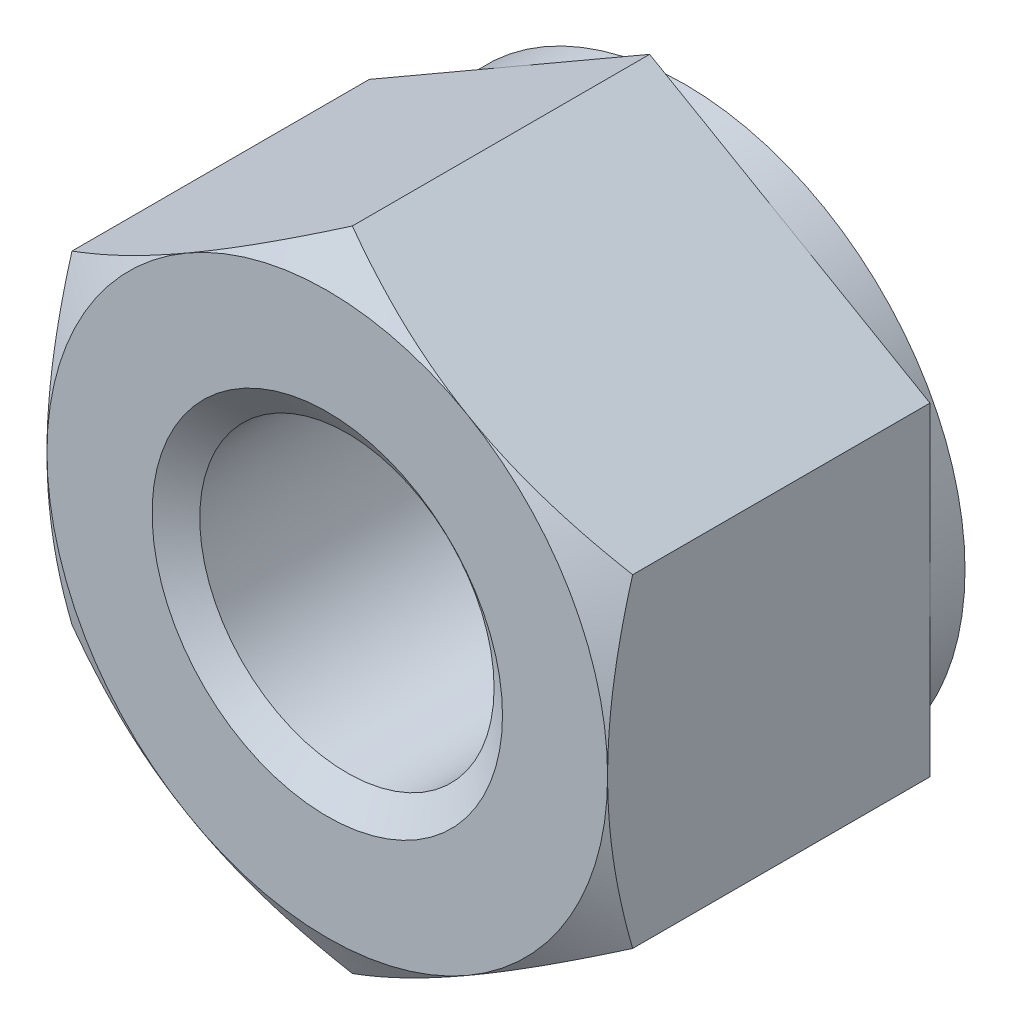
ISO-10303-21;
HEADER;
FILE_DESCRIPTION(('STEP AP214'),'2;1');
FILE_NAME('part.step','',(''),(''),'','','');
FILE_SCHEMA(('AUTOMOTIVE_DESIGN { 1 0 10303 214 1 1 1 1 }'));
ENDSEC;
DATA;
#1=APPLICATION_CONTEXT('core data for automotive mechanical design processes');
#2=APPLICATION_PROTOCOL_DEFINITION('international standard','automotive_design',2000,#1);
#3=PRODUCT_CONTEXT('',#1,'mechanical');
#4=PRODUCT('Part','Part','',(#3));
#5=PRODUCT_RELATED_PRODUCT_CATEGORY('part','',(#4));
#6=PRODUCT_DEFINITION_FORMATION('','',#4);
#7=PRODUCT_DEFINITION_CONTEXT('part definition',#1,'design');
#8=PRODUCT_DEFINITION('design','',#6,#7);
#9=PRODUCT_DEFINITION_SHAPE('','',#8);
#10=(LENGTH_UNIT() NAMED_UNIT(*) SI_UNIT(.MILLI.,.METRE.));
#11=(NAMED_UNIT(*) PLANE_ANGLE_UNIT() SI_UNIT($,.RADIAN.));
#12=(NAMED_UNIT(*) SI_UNIT($,.STERADIAN.) SOLID_ANGLE_UNIT());
#13=UNCERTAINTY_MEASURE_WITH_UNIT(LENGTH_MEASURE(1.E-05),#10,'distance_accuracy_value','');
#14=(GEOMETRIC_REPRESENTATION_CONTEXT(3) GLOBAL_UNCERTAINTY_ASSIGNED_CONTEXT((#13)) GLOBAL_UNIT_ASSIGNED_CONTEXT((#10,
#11,#12)) REPRESENTATION_CONTEXT('',''));
#15=CARTESIAN_POINT('',(0.,0.,0.));
#16=DIRECTION('',(0.,0.,1.));
#17=DIRECTION('',(1.,0.,0.));
#18=AXIS2_PLACEMENT_3D('',#15,#16,#17);
#19=CARTESIAN_POINT('',(0.,0.,-5.1));
#20=DIRECTION('',(0.,0.,1.));
#21=DIRECTION('',(1.,0.,0.));
#22=AXIS2_PLACEMENT_3D('',#19,#20,#21);
#23=CYLINDRICAL_SURFACE('',#22,2.1);
#24=CARTESIAN_POINT('',(0.,0.,-0.28008301528388));
#25=DIRECTION('',(0.,0.,1.));
#26=DIRECTION('',(1.,0.,0.));
#27=AXIS2_PLACEMENT_3D('',#24,#25,#26);
#28=CIRCLE('',#27,2.1);
#29=CARTESIAN_POINT('',(2.1,0.,-0.28008301528388));
#30=VERTEX_POINT('',#29);
#31=EDGE_CURVE('E158',#30,#30,#28,.F.);
#32=ORIENTED_EDGE('',*,*,#31,.F.);
#33=EDGE_LOOP('',(#32));
#34=FACE_BOUND('',#33,.T.);
#35=CARTESIAN_POINT('',(0.,0.,-4.79451698471612));
#36=DIRECTION('',(0.,0.,-1.));
#37=DIRECTION('',(-1.,0.,0.));
#38=AXIS2_PLACEMENT_3D('',#35,#36,#37);
#39=CIRCLE('',#38,2.1);
#40=CARTESIAN_POINT('',(-2.1,0.,-4.79451698471612));
#41=VERTEX_POINT('',#40);
#42=EDGE_CURVE('E48',#41,#41,#39,.F.);
#43=ORIENTED_EDGE('',*,*,#42,.F.);
#44=EDGE_LOOP('',(#43));
#45=FACE_BOUND('',#44,.T.);
#46=ADVANCED_FACE('F43',(#34,#45),#23,.F.);
#47=CARTESIAN_POINT('',(0.,4.61880215351702,-5.1));
#48=DIRECTION('',(-0.500000000000002,0.866025403784437,0.));
#49=DIRECTION('',(-0.866025403784437,-0.500000000000002,0.));
#50=AXIS2_PLACEMENT_3D('',#47,#48,#49);
#51=PLANE('',#50);
#52=DIRECTION('',(0.,0.,1.));
#53=VECTOR('',#52,1.);
#54=CARTESIAN_POINT('',(-4.,2.3094010767585,-5.1));
#55=LINE('',#54,#53);
#56=CARTESIAN_POINT('',(-4.,2.3094010767585,-4.6));
#57=VERTEX_POINT('',#56);
#58=CARTESIAN_POINT('',(-4.,2.3094010767585,-0.357265589908173));
#59=VERTEX_POINT('',#58);
#60=EDGE_CURVE('E305',#57,#59,#55,.T.);
#61=ORIENTED_EDGE('',*,*,#60,.T.);
#62=CARTESIAN_POINT('',(-4.0002,2.30928560670466,-0.357332259074767));
#63=CARTESIAN_POINT('',(-3.82442084967677,2.4107717464617,-0.298717873648282));
#64=CARTESIAN_POINT('',(-3.64712438367362,2.51313390883499,-0.245410321462262));
#65=CARTESIAN_POINT('',(-3.28946140682429,2.71963072479811,-0.152361670746403));
#66=CARTESIAN_POINT('',(-3.10908854102985,2.82376904741904,-0.112653489029703));
#67=CARTESIAN_POINT('',(-2.75057818129721,3.03075510011795,-0.0508422152802783));
#68=CARTESIAN_POINT('',(-2.57249584706486,3.13357098372491,-0.028327731522888));
#69=CARTESIAN_POINT('',(-2.21549328283349,3.33968651028528,-0.00145062314658108));
#70=CARTESIAN_POINT('',(-2.0365743503559,3.44298540411434,0.00293425857305725));
#71=CARTESIAN_POINT('',(-1.70225715780327,3.63600352522932,-0.0061900729399704));
#72=CARTESIAN_POINT('',(-1.54680884001293,3.72575165335065,-0.0174589539879948));
#73=CARTESIAN_POINT('',(-1.23692494436494,3.90466320392055,-0.0531739907981949));
#74=CARTESIAN_POINT('',(-1.08249043825587,3.99382600759479,-0.0776323457115356));
#75=CARTESIAN_POINT('',(-0.771967672225416,4.17310641015198,-0.138776064919294));
#76=CARTESIAN_POINT('',(-0.61591871193689,4.26320131938132,-0.175720603654869));
#77=CARTESIAN_POINT('',(-0.306148164596151,4.44204742827552,-0.259570072548035));
#78=CARTESIAN_POINT('',(-0.15242260922621,4.53080091904968,-0.306455302212749));
#79=CARTESIAN_POINT('',(0.000200000000011687,4.61891762357086,-0.357332259074777));
#80=B_SPLINE_CURVE_WITH_KNOTS('',3,(#62,#63,#64,#65,#66,#67,#68,#69,#70,#71,#72,#73,#74,#75,#76,
#77,#78,#79),.UNSPECIFIED.,.F.,.F.,(4,2,2,2,2,2,2,2,4),(0.,0.634047835695966,1.26961969224543,
1.88946157213122,2.50854226669297,3.04757825393386,3.58711366126904,4.13861653143765,
4.68903648037745),.UNSPECIFIED.);
#81=CARTESIAN_POINT('',(-2.00000000000001,3.46410161513775,0.));
#82=VERTEX_POINT('',#81);
#83=EDGE_CURVE('E69',#59,#82,#80,.T.);
#84=ORIENTED_EDGE('',*,*,#83,.T.);
#85=CARTESIAN_POINT('',(0.,4.61880215351702,-0.357265589908173));
#86=VERTEX_POINT('',#85);
#87=EDGE_CURVE('E172',#82,#86,#80,.T.);
#88=ORIENTED_EDGE('',*,*,#87,.T.);
#89=DIRECTION('',(0.,0.,1.));
#90=VECTOR('',#89,1.);
#91=CARTESIAN_POINT('',(0.,4.61880215351702,-5.1));
#92=LINE('',#91,#90);
#93=CARTESIAN_POINT('',(0.,4.61880215351702,-4.6));
#94=VERTEX_POINT('',#93);
#95=EDGE_CURVE('E288',#94,#86,#92,.T.);
#96=ORIENTED_EDGE('',*,*,#95,.F.);
#97=DIRECTION('',(-0.866025403784437,-0.500000000000002,0.));
#98=VECTOR('',#97,1.);
#99=CARTESIAN_POINT('',(0.,4.61880215351702,-4.6));
#100=LINE('',#99,#98);
#101=CARTESIAN_POINT('',(-2.00000000000001,3.46410161513775,-4.6));
#102=VERTEX_POINT('',#101);
#103=EDGE_CURVE('E277',#94,#102,#100,.T.);
#104=ORIENTED_EDGE('',*,*,#103,.T.);
#105=EDGE_CURVE('E274',#102,#57,#100,.T.);
#106=ORIENTED_EDGE('',*,*,#105,.T.);
#107=EDGE_LOOP('',(#61,#84,#88,#96,#104,#106));
#108=FACE_BOUND('',#107,.T.);
#109=ADVANCED_FACE('F44',(#108),#51,.T.);
#110=CARTESIAN_POINT('',(4.,2.30940107675848,-5.1));
#111=DIRECTION('',(0.500000000000007,0.866025403784435,0.));
#112=DIRECTION('',(-0.866025403784435,0.500000000000007,0.));
#113=AXIS2_PLACEMENT_3D('',#110,#111,#112);
#114=PLANE('',#113);
#115=ORIENTED_EDGE('',*,*,#95,.T.);
#116=CARTESIAN_POINT('',(-0.00019999999998845,4.61891762357086,-0.357332259074777));
#117=CARTESIAN_POINT('',(0.175579150323239,4.51743148381382,-0.298717873648291));
#118=CARTESIAN_POINT('',(0.352875616326392,4.41506932144053,-0.245410321462271));
#119=CARTESIAN_POINT('',(0.710538593175717,4.2085725054774,-0.152361670746409));
#120=CARTESIAN_POINT('',(0.890911458970162,4.10443418285647,-0.112653489029709));
#121=CARTESIAN_POINT('',(1.2494218187028,3.89744813015756,-0.0508422152802821));
#122=CARTESIAN_POINT('',(1.42750415293515,3.79463224655059,-0.0283277315228908));
#123=CARTESIAN_POINT('',(1.78450671716652,3.58851671999022,-0.00145062314658208));
#124=CARTESIAN_POINT('',(1.96342564964411,3.48521782616116,0.00293425857305709));
#125=CARTESIAN_POINT('',(2.29774284219674,3.29219970504618,-0.00619007293996893));
#126=CARTESIAN_POINT('',(2.45319115998707,3.20245157692485,-0.0174589539879924));
#127=CARTESIAN_POINT('',(2.76307505563506,3.02354002635495,-0.0531739907981907));
#128=CARTESIAN_POINT('',(2.91750956174414,2.93437722268071,-0.0776323457115305));
#129=CARTESIAN_POINT('',(3.22803232777458,2.75509682012352,-0.138776064919287));
#130=CARTESIAN_POINT('',(3.38408128806311,2.66500191089418,-0.175720603654861));
#131=CARTESIAN_POINT('',(3.69385183540384,2.48615580199999,-0.259570072548024));
#132=CARTESIAN_POINT('',(3.84757739077378,2.39740231122583,-0.306455302212737));
#133=CARTESIAN_POINT('',(4.0002,2.30928560670464,-0.357332259074764));
#134=B_SPLINE_CURVE_WITH_KNOTS('',3,(#116,#117,#118,#119,#120,#121,#122,#123,#124,#125,#126,
#127,#128,#129,#130,#131,#132,#133),.UNSPECIFIED.,.F.,.F.,(4,2,2,2,2,2,2,2,4),(0.,
0.634047835695969,1.26961969224544,1.88946157213123,2.50854226669298,3.04757825393387,
3.58711366126904,4.13861653143765,4.68903648037744),.UNSPECIFIED.);
#135=CARTESIAN_POINT('',(2.00000000000003,3.46410161513774,0.));
#136=VERTEX_POINT('',#135);
#137=EDGE_CURVE('E171',#86,#136,#134,.T.);
#138=ORIENTED_EDGE('',*,*,#137,.T.);
#139=CARTESIAN_POINT('',(4.,2.30940107675852,-0.357265589908173));
#140=VERTEX_POINT('',#139);
#141=EDGE_CURVE('E151',#136,#140,#134,.T.);
#142=ORIENTED_EDGE('',*,*,#141,.T.);
#143=DIRECTION('',(0.,0.,1.));
#144=VECTOR('',#143,1.);
#145=CARTESIAN_POINT('',(4.,2.30940107675848,-5.1));
#146=LINE('',#145,#144);
#147=CARTESIAN_POINT('',(4.,2.30940107675848,-4.6));
#148=VERTEX_POINT('',#147);
#149=EDGE_CURVE('E167',#148,#140,#146,.T.);
#150=ORIENTED_EDGE('',*,*,#149,.F.);
#151=DIRECTION('',(-0.866025403784435,0.500000000000007,0.));
#152=VECTOR('',#151,1.);
#153=CARTESIAN_POINT('',(4.,2.30940107675848,-4.6));
#154=LINE('',#153,#152);
#155=CARTESIAN_POINT('',(2.00000000000003,3.46410161513774,-4.6));
#156=VERTEX_POINT('',#155);
#157=EDGE_CURVE('E287',#148,#156,#154,.T.);
#158=ORIENTED_EDGE('',*,*,#157,.T.);
#159=EDGE_CURVE('E284',#156,#94,#154,.T.);
#160=ORIENTED_EDGE('',*,*,#159,.T.);
#161=EDGE_LOOP('',(#115,#138,#142,#150,#158,#160));
#162=FACE_BOUND('',#161,.T.);
#163=ADVANCED_FACE('F248',(#162),#114,.T.);
#164=CARTESIAN_POINT('',(4.,2.30940107675848,-5.1));
#165=DIRECTION('',(-1.,0.,0.));
#166=DIRECTION('',(0.,0.,1.));
#167=AXIS2_PLACEMENT_3D('',#164,#165,#166);
#168=PLANE('',#167);
#169=CARTESIAN_POINT('',(4.,-6.12487198995896,-1.91410682124067));
#170=CARTESIAN_POINT('',(4.,-5.9492493703868,-1.82923627076692));
#171=CARTESIAN_POINT('',(4.,-5.7732115209529,-1.74520940380742));
#172=CARTESIAN_POINT('',(4.,-5.42008084777958,-1.57932514679719));
#173=CARTESIAN_POINT('',(4.,-5.24298784779932,-1.49746813236725));
#174=CARTESIAN_POINT('',(4.,-4.88656571686338,-1.33597446305858));
#175=CARTESIAN_POINT('',(4.,-4.70722958889366,-1.25635319506306));
#176=CARTESIAN_POINT('',(4.,-4.34708334747267,-1.10053058542032));
#177=CARTESIAN_POINT('',(4.,-4.16627331143541,-1.02432906550804));
#178=CARTESIAN_POINT('',(4.,-3.80064706744981,-0.87535065039438));
#179=CARTESIAN_POINT('',(4.,-3.61580892822773,-0.802627284215862));
#180=CARTESIAN_POINT('',(4.,-3.24395246794972,-0.662876230959435));
#181=CARTESIAN_POINT('',(4.,-3.05693390695804,-0.595849177566519));
#182=CARTESIAN_POINT('',(4.,-2.68080318253774,-0.469291748430895));
#183=CARTESIAN_POINT('',(4.,-2.49169643712852,-0.40974543478385));
#184=CARTESIAN_POINT('',(4.,-2.11079454635854,-0.300083356544517));
#185=CARTESIAN_POINT('',(4.,-1.91900027185752,-0.249964609676762));
#186=CARTESIAN_POINT('',(4.,-1.53259232698203,-0.16159079495405));
#187=CARTESIAN_POINT('',(4.,-1.33797792031652,-0.123338885956547));
#188=CARTESIAN_POINT('',(4.,-0.946402725872581,-0.0612742359223489));
#189=CARTESIAN_POINT('',(4.,-0.7494419360198,-0.0374615076517035));
#190=CARTESIAN_POINT('',(4.,-0.355451989627968,-0.00638181314943949));
#191=CARTESIAN_POINT('',(4.,-0.158431311094036,0.000989900761038697));
#192=CARTESIAN_POINT('',(4.,0.235472085607446,-0.00120406637479723));
#193=CARTESIAN_POINT('',(4.,0.432354826312183,-0.0107653508153519));
#194=CARTESIAN_POINT('',(4.,0.768560635225494,-0.0408787346135909));
#195=CARTESIAN_POINT('',(4.,0.908254618381796,-0.0575092960439095));
#196=CARTESIAN_POINT('',(4.,1.18656349063495,-0.0982134103466905));
#197=CARTESIAN_POINT('',(4.,1.32517820601011,-0.122288137058444));
#198=CARTESIAN_POINT('',(4.,1.73929045452967,-0.204415070950227));
#199=CARTESIAN_POINT('',(4.,2.01284690528719,-0.272348886425149));
#200=CARTESIAN_POINT('',(4.,2.42218253014521,-0.389516359317197));
#201=CARTESIAN_POINT('',(4.,2.56009536361535,-0.43171394181163));
#202=CARTESIAN_POINT('',(4.,2.834481591014,-0.520284580227755));
#203=CARTESIAN_POINT('',(4.,2.97095590623554,-0.566654756186904));
#204=CARTESIAN_POINT('',(4.,3.24189440516337,-0.662605699180277));
#205=CARTESIAN_POINT('',(4.,3.37636557946834,-0.71216692575349));
#206=CARTESIAN_POINT('',(4.,3.6442646115291,-0.814198353790691));
#207=CARTESIAN_POINT('',(4.,3.77769202239383,-0.866669730963358));
#208=CARTESIAN_POINT('',(4.,3.9106369898668,-0.920309006541781));
#209=B_SPLINE_CURVE_WITH_KNOTS('',3,(#169,#170,#171,#172,#173,#174,#175,#176,#177,#178,#179,
#180,#181,#182,#183,#184,#185,#186,#187,#188,#189,#190,#191,#192,#193,#194,#195,#196,#197,#198,
#199,#200,#201,#202,#203,#204,#205,#206,#207,#208),.UNSPECIFIED.,.F.,.F.,(4,2,2,2,2,2,2,2,2,2,2,
2,2,2,2,2,2,2,2,4),(0.,0.585171792532273,1.17044423059927,1.7590659464599,2.34765694284828,
2.94347400997484,3.5393572721069,4.13394864697602,4.72835161391473,5.32291267067847,
5.91747425310815,6.50823685854039,7.09884609659889,7.52068140825524,7.94258327130842,
8.78701491359831,9.2196528189769,9.65199437116298,10.0819024146297,10.5119854255247),.UNSPECIFIED.);
#210=CARTESIAN_POINT('',(3.99999999999999,-2.30940107675855,-0.357265589908173));
#211=VERTEX_POINT('',#210);
#212=CARTESIAN_POINT('',(4.,0.,0.));
#213=VERTEX_POINT('',#212);
#214=EDGE_CURVE('E133',#211,#213,#209,.T.);
#215=ORIENTED_EDGE('',*,*,#214,.F.);
#216=DIRECTION('',(0.,0.,1.));
#217=VECTOR('',#216,1.);
#218=CARTESIAN_POINT('',(4.,-2.30940107675854,-5.1));
#219=LINE('',#218,#217);
#220=CARTESIAN_POINT('',(4.,-2.30940107675854,-4.6));
#221=VERTEX_POINT('',#220);
#222=EDGE_CURVE('E294',#221,#211,#219,.T.);
#223=ORIENTED_EDGE('',*,*,#222,.F.);
#224=DIRECTION('',(0.,-1.,0.));
#225=VECTOR('',#224,1.);
#226=CARTESIAN_POINT('',(4.,2.30940107675848,-4.6));
#227=LINE('',#226,#225);
#228=CARTESIAN_POINT('',(4.,0.,-4.6));
#229=VERTEX_POINT('',#228);
#230=EDGE_CURVE('E289',#229,#221,#227,.T.);
#231=ORIENTED_EDGE('',*,*,#230,.F.);
#232=EDGE_CURVE('E286',#148,#229,#227,.T.);
#233=ORIENTED_EDGE('',*,*,#232,.F.);
#234=ORIENTED_EDGE('',*,*,#149,.T.);
#235=EDGE_CURVE('E147',#213,#140,#209,.T.);
#236=ORIENTED_EDGE('',*,*,#235,.F.);
#237=EDGE_LOOP('',(#215,#223,#231,#233,#234,#236));
#238=FACE_BOUND('',#237,.T.);
#239=ADVANCED_FACE('F170',(#238),#168,.F.);
#240=CARTESIAN_POINT('',(0.,-4.61880215351706,-5.1));
#241=DIRECTION('',(0.500000000000003,-0.866025403784437,0.));
#242=DIRECTION('',(0.866025403784437,0.500000000000003,0.));
#243=AXIS2_PLACEMENT_3D('',#240,#241,#242);
#244=PLANE('',#243);
#245=ORIENTED_EDGE('',*,*,#222,.T.);
#246=CARTESIAN_POINT('',(4.0002,-2.3092856067047,-0.357332259074781));
#247=CARTESIAN_POINT('',(3.82442084967677,-2.41077174646174,-0.298717873648297));
#248=CARTESIAN_POINT('',(3.64712438367362,-2.51313390883503,-0.245410321462277));
#249=CARTESIAN_POINT('',(3.28946140682429,-2.71963072479816,-0.152361670746419));
#250=CARTESIAN_POINT('',(3.10908854102985,-2.82376904741908,-0.112653489029721));
#251=CARTESIAN_POINT('',(2.75057818129721,-3.03075510011799,-0.0508422152802972));
#252=CARTESIAN_POINT('',(2.57249584706485,-3.13357098372496,-0.028327731522908));
#253=CARTESIAN_POINT('',(2.21549328283349,-3.33968651028533,-0.00145062314660312));
#254=CARTESIAN_POINT('',(2.03657435035589,-3.44298540411439,0.00293425857303441));
#255=CARTESIAN_POINT('',(1.70225715780326,-3.63600352522937,-0.00619007293999506));
#256=CARTESIAN_POINT('',(1.54680884001293,-3.7257516533507,-0.0174589539880203));
#257=CARTESIAN_POINT('',(1.23692494436494,-3.9046632039206,-0.0531739907982211));
#258=CARTESIAN_POINT('',(1.08249043825586,-3.99382600759484,-0.0776323457115617));
#259=CARTESIAN_POINT('',(0.771967672225417,-4.17310641015202,-0.13877606491932));
#260=CARTESIAN_POINT('',(0.615918711936894,-4.26320131938136,-0.175720603654895));
#261=CARTESIAN_POINT('',(0.306148164596158,-4.44204742827556,-0.25957007254806));
#262=CARTESIAN_POINT('',(0.152422609226218,-4.53080091904972,-0.306455302212774));
#263=CARTESIAN_POINT('',(-0.000200000000001949,-4.6189176235709,-0.357332259074801));
#264=B_SPLINE_CURVE_WITH_KNOTS('',3,(#246,#247,#248,#249,#250,#251,#252,#253,#254,#255,#256,
#257,#258,#259,#260,#261,#262,#263),.UNSPECIFIED.,.F.,.F.,(4,2,2,2,2,2,2,2,4),(0.,
0.63404783569597,1.26961969224544,1.88946157213123,2.50854226669299,3.04757825393387,
3.58711366126905,4.13861653143765,4.68903648037745),.UNSPECIFIED.);
#265=CARTESIAN_POINT('',(2.00000000000001,-3.46410161513775,0.));
#266=VERTEX_POINT('',#265);
#267=EDGE_CURVE('E145',#211,#266,#264,.T.);
#268=ORIENTED_EDGE('',*,*,#267,.T.);
#269=CARTESIAN_POINT('',(0.,-4.61880215351702,-0.357265589908173));
#270=VERTEX_POINT('',#269);
#271=EDGE_CURVE('E185',#266,#270,#264,.T.);
#272=ORIENTED_EDGE('',*,*,#271,.T.);
#273=DIRECTION('',(0.,0.,1.));
#274=VECTOR('',#273,1.);
#275=CARTESIAN_POINT('',(0.,-4.61880215351706,-5.1));
#276=LINE('',#275,#274);
#277=CARTESIAN_POINT('',(0.,-4.61880215351706,-4.6));
#278=VERTEX_POINT('',#277);
#279=EDGE_CURVE('E300',#278,#270,#276,.T.);
#280=ORIENTED_EDGE('',*,*,#279,.F.);
#281=DIRECTION('',(0.866025403784437,0.500000000000003,0.));
#282=VECTOR('',#281,1.);
#283=CARTESIAN_POINT('',(0.,-4.61880215351706,-4.6));
#284=LINE('',#283,#282);
#285=CARTESIAN_POINT('',(2.00000000000003,-3.46410161513778,-4.6));
#286=VERTEX_POINT('',#285);
#287=EDGE_CURVE('E280',#278,#286,#284,.T.);
#288=ORIENTED_EDGE('',*,*,#287,.T.);
#289=EDGE_CURVE('E285',#286,#221,#284,.T.);
#290=ORIENTED_EDGE('',*,*,#289,.T.);
#291=EDGE_LOOP('',(#245,#268,#272,#280,#288,#290));
#292=FACE_BOUND('',#291,.T.);
#293=ADVANCED_FACE('F230',(#292),#244,.T.);
#294=CARTESIAN_POINT('',(-4.,-2.30940107675853,-5.1));
#295=DIRECTION('',(-0.500000000000006,-0.866025403784435,0.));
#296=DIRECTION('',(0.866025403784435,-0.500000000000006,0.));
#297=AXIS2_PLACEMENT_3D('',#294,#295,#296);
#298=PLANE('',#297);
#299=ORIENTED_EDGE('',*,*,#279,.T.);
#300=CARTESIAN_POINT('',(0.000199999999997729,-4.6189176235709,-0.357332259074802));
#301=CARTESIAN_POINT('',(-0.175579150323232,-4.51743148381386,-0.298717873648316));
#302=CARTESIAN_POINT('',(-0.352875616326386,-4.41506932144057,-0.245410321462294));
#303=CARTESIAN_POINT('',(-0.710538593175715,-4.20857250547744,-0.152361670746431));
#304=CARTESIAN_POINT('',(-0.890911458970161,-4.10443418285651,-0.112653489029731));
#305=CARTESIAN_POINT('',(-1.2494218187028,-3.8974481301576,-0.0508422152803028));
#306=CARTESIAN_POINT('',(-1.42750415293516,-3.79463224655063,-0.0283277315229115));
#307=CARTESIAN_POINT('',(-1.78450671716653,-3.58851671999026,-0.00145062314660262));
#308=CARTESIAN_POINT('',(-1.96342564964412,-3.4852178261612,0.0029342585730368));
#309=CARTESIAN_POINT('',(-2.29774284219675,-3.29219970504621,-0.00619007293998878));
#310=CARTESIAN_POINT('',(-2.45319115998708,-3.20245157692489,-0.0174589539880118));
#311=CARTESIAN_POINT('',(-2.76307505563507,-3.02354002635499,-0.0531739907982091));
#312=CARTESIAN_POINT('',(-2.91750956174414,-2.93437722268075,-0.0776323457115483));
#313=CARTESIAN_POINT('',(-3.22803232777459,-2.75509682012356,-0.138776064919303));
#314=CARTESIAN_POINT('',(-3.38408128806311,-2.66500191089422,-0.175720603654876));
#315=CARTESIAN_POINT('',(-3.69385183540384,-2.48615580200003,-0.259570072548038));
#316=CARTESIAN_POINT('',(-3.84757739077378,-2.39740231122587,-0.30645530221275));
#317=CARTESIAN_POINT('',(-4.0002,-2.30928560670469,-0.357332259074776));
#318=B_SPLINE_CURVE_WITH_KNOTS('',3,(#300,#301,#302,#303,#304,#305,#306,#307,#308,#309,#310,
#311,#312,#313,#314,#315,#316,#317),.UNSPECIFIED.,.F.,.F.,(4,2,2,2,2,2,2,2,4),(0.,
0.634047835695975,1.26961969224545,1.88946157213125,2.508542266693,3.04757825393389,
3.58711366126906,4.13861653143766,4.68903648037745),.UNSPECIFIED.);
#319=CARTESIAN_POINT('',(-2.00000000000002,-3.46410161513774,0.));
#320=VERTEX_POINT('',#319);
#321=EDGE_CURVE('E225',#270,#320,#318,.T.);
#322=ORIENTED_EDGE('',*,*,#321,.T.);
#323=CARTESIAN_POINT('',(-4.,-2.30940107675853,-0.357265589908173));
#324=VERTEX_POINT('',#323);
#325=EDGE_CURVE('E211',#320,#324,#318,.T.);
#326=ORIENTED_EDGE('',*,*,#325,.T.);
#327=DIRECTION('',(0.,0.,1.));
#328=VECTOR('',#327,1.);
#329=CARTESIAN_POINT('',(-4.,-2.30940107675853,-5.1));
#330=LINE('',#329,#328);
#331=CARTESIAN_POINT('',(-4.,-2.30940107675853,-4.6));
#332=VERTEX_POINT('',#331);
#333=EDGE_CURVE('E297',#332,#324,#330,.T.);
#334=ORIENTED_EDGE('',*,*,#333,.F.);
#335=DIRECTION('',(0.866025403784435,-0.500000000000006,0.));
#336=VECTOR('',#335,1.);
#337=CARTESIAN_POINT('',(-4.,-2.30940107675853,-4.6));
#338=LINE('',#337,#336);
#339=CARTESIAN_POINT('',(-2.00000000000004,-3.46410161513777,-4.6));
#340=VERTEX_POINT('',#339);
#341=EDGE_CURVE('E266',#332,#340,#338,.T.);
#342=ORIENTED_EDGE('',*,*,#341,.T.);
#343=EDGE_CURVE('E273',#340,#278,#338,.T.);
#344=ORIENTED_EDGE('',*,*,#343,.T.);
#345=EDGE_LOOP('',(#299,#322,#326,#334,#342,#344));
#346=FACE_BOUND('',#345,.T.);
#347=ADVANCED_FACE('F223',(#346),#298,.T.);
#348=CARTESIAN_POINT('',(-4.,2.3094010767585,-5.1));
#349=DIRECTION('',(-1.,0.,0.));
#350=DIRECTION('',(0.,0.,1.));
#351=AXIS2_PLACEMENT_3D('',#348,#349,#350);
#352=PLANE('',#351);
#353=ORIENTED_EDGE('',*,*,#333,.T.);
#354=CARTESIAN_POINT('',(-4.,-6.12487198995894,-1.91410682124065));
#355=CARTESIAN_POINT('',(-4.,-5.94924937038678,-1.82923627076691));
#356=CARTESIAN_POINT('',(-4.,-5.77321152095288,-1.74520940380741));
#357=CARTESIAN_POINT('',(-4.,-5.42008084777957,-1.57932514679718));
#358=CARTESIAN_POINT('',(-4.,-5.2429878477993,-1.49746813236724));
#359=CARTESIAN_POINT('',(-4.,-4.88656571686336,-1.33597446305857));
#360=CARTESIAN_POINT('',(-4.,-4.70722958889364,-1.25635319506305));
#361=CARTESIAN_POINT('',(-4.,-4.34708334747265,-1.10053058542031));
#362=CARTESIAN_POINT('',(-4.,-4.16627331143539,-1.02432906550803));
#363=CARTESIAN_POINT('',(-4.,-3.80064706744979,-0.875350650394372));
#364=CARTESIAN_POINT('',(-4.,-3.61580892822772,-0.802627284215854));
#365=CARTESIAN_POINT('',(-4.,-3.2439524679497,-0.662876230959428));
#366=CARTESIAN_POINT('',(-4.,-3.05693390695803,-0.595849177566512));
#367=CARTESIAN_POINT('',(-4.,-2.68080318253772,-0.469291748430888));
#368=CARTESIAN_POINT('',(-4.,-2.4916964371285,-0.409745434783843));
#369=CARTESIAN_POINT('',(-4.,-2.11079454635853,-0.300083356544512));
#370=CARTESIAN_POINT('',(-4.,-1.9190002718575,-0.249964609676757));
#371=CARTESIAN_POINT('',(-4.,-1.53259232698202,-0.161590794954046));
#372=CARTESIAN_POINT('',(-4.,-1.33797792031651,-0.123338885956544));
#373=CARTESIAN_POINT('',(-4.,-0.94640272587257,-0.0612742359223456));
#374=CARTESIAN_POINT('',(-4.,-0.749441936019789,-0.0374615076517003));
#375=CARTESIAN_POINT('',(-4.,-0.355451989627957,-0.00638181314943678));
#376=CARTESIAN_POINT('',(-4.,-0.158431311094025,0.000989900761040949));
#377=CARTESIAN_POINT('',(-4.,0.235472085607455,-0.00120406637479548));
#378=CARTESIAN_POINT('',(-4.,0.432354826312192,-0.0107653508153502));
#379=CARTESIAN_POINT('',(-4.,0.768560635225503,-0.0408787346135896));
#380=CARTESIAN_POINT('',(-4.,0.908254618381805,-0.0575092960439083));
#381=CARTESIAN_POINT('',(-4.,1.18656349063496,-0.0982134103466896));
#382=CARTESIAN_POINT('',(-4.,1.32517820601011,-0.122288137058444));
#383=CARTESIAN_POINT('',(-4.,1.73929045452967,-0.204415070950227));
#384=CARTESIAN_POINT('',(-4.,2.0128469052872,-0.272348886425149));
#385=CARTESIAN_POINT('',(-4.,2.42218253014522,-0.389516359317199));
#386=CARTESIAN_POINT('',(-4.,2.56009536361536,-0.431713941811631));
#387=CARTESIAN_POINT('',(-4.,2.83448159101401,-0.520284580227757));
#388=CARTESIAN_POINT('',(-4.,2.97095590623555,-0.566654756186906));
#389=CARTESIAN_POINT('',(-4.,3.24189440516338,-0.662605699180279));
#390=CARTESIAN_POINT('',(-4.,3.37636557946836,-0.712166925753493));
#391=CARTESIAN_POINT('',(-4.,3.64426461152911,-0.814198353790694));
#392=CARTESIAN_POINT('',(-4.,3.77769202239384,-0.866669730963361));
#393=CARTESIAN_POINT('',(-4.,3.91063698986681,-0.920309006541784));
#394=B_SPLINE_CURVE_WITH_KNOTS('',3,(#354,#355,#356,#357,#358,#359,#360,#361,#362,#363,#364,
#365,#366,#367,#368,#369,#370,#371,#372,#373,#374,#375,#376,#377,#378,#379,#380,#381,#382,#383,
#384,#385,#386,#387,#388,#389,#390,#391,#392,#393),.UNSPECIFIED.,.F.,.F.,(4,2,2,2,2,2,2,2,2,2,2,
2,2,2,2,2,2,2,2,4),(0.,0.585171792532271,1.17044423059927,1.7590659464599,2.34765694284827,
2.94347400997484,3.5393572721069,4.13394864697601,4.72835161391472,5.32291267067846,
5.91747425310814,6.50823685854038,7.09884609659888,7.52068140825522,7.9425832713084,
8.7870149135983,9.21965281897689,9.65199437116297,10.0819024146297,10.5119854255247),.UNSPECIFIED.);
#395=CARTESIAN_POINT('',(-4.,0.,0.));
#396=VERTEX_POINT('',#395);
#397=EDGE_CURVE('E221',#324,#396,#394,.T.);
#398=ORIENTED_EDGE('',*,*,#397,.T.);
#399=EDGE_CURVE('E156',#396,#59,#394,.T.);
#400=ORIENTED_EDGE('',*,*,#399,.T.);
#401=ORIENTED_EDGE('',*,*,#60,.F.);
#402=DIRECTION('',(0.,-1.,0.));
#403=VECTOR('',#402,1.);
#404=CARTESIAN_POINT('',(-4.,2.3094010767585,-4.6));
#405=LINE('',#404,#403);
#406=CARTESIAN_POINT('',(-4.,0.,-4.6));
#407=VERTEX_POINT('',#406);
#408=EDGE_CURVE('E307',#57,#407,#405,.T.);
#409=ORIENTED_EDGE('',*,*,#408,.T.);
#410=EDGE_CURVE('E310',#407,#332,#405,.T.);
#411=ORIENTED_EDGE('',*,*,#410,.T.);
#412=EDGE_LOOP('',(#353,#398,#400,#401,#409,#411));
#413=FACE_BOUND('',#412,.T.);
#414=ADVANCED_FACE('F226',(#413),#352,.T.);
#415=CARTESIAN_POINT('',(0.,4.61880215351702,0.));
#416=DIRECTION('',(0.,0.,-1.));
#417=DIRECTION('',(-1.,0.,0.));
#418=AXIS2_PLACEMENT_3D('',#415,#416,#417);
#419=PLANE('',#418);
#420=CARTESIAN_POINT('',(0.,0.,0.));
#421=DIRECTION('',(0.,0.,1.));
#422=DIRECTION('',(1.,0.,0.));
#423=AXIS2_PLACEMENT_3D('',#420,#421,#422);
#424=CIRCLE('',#423,2.5);
#425=CARTESIAN_POINT('',(2.5,0.,0.));
#426=VERTEX_POINT('',#425);
#427=EDGE_CURVE('E315',#426,#426,#424,.T.);
#428=ORIENTED_EDGE('',*,*,#427,.F.);
#429=EDGE_LOOP('',(#428));
#430=FACE_BOUND('',#429,.T.);
#431=CARTESIAN_POINT('',(0.,0.,0.));
#432=DIRECTION('',(0.,0.,-1.));
#433=DIRECTION('',(-1.,0.,0.));
#434=AXIS2_PLACEMENT_3D('',#431,#432,#433);
#435=CIRCLE('',#434,4.);
#436=EDGE_CURVE('E54',#82,#396,#435,.F.);
#437=ORIENTED_EDGE('',*,*,#436,.T.);
#438=EDGE_CURVE('E12',#396,#320,#435,.F.);
#439=ORIENTED_EDGE('',*,*,#438,.T.);
#440=EDGE_CURVE('E52',#320,#266,#435,.F.);
#441=ORIENTED_EDGE('',*,*,#440,.T.);
#442=EDGE_CURVE('E136',#266,#213,#435,.F.);
#443=ORIENTED_EDGE('',*,*,#442,.T.);
#444=CARTESIAN_POINT('',(0.,0.,0.));
#445=DIRECTION('',(0.,0.,1.));
#446=DIRECTION('',(1.,0.,0.));
#447=AXIS2_PLACEMENT_3D('',#444,#445,#446);
#448=CIRCLE('',#447,4.);
#449=EDGE_CURVE('E152',#213,#136,#448,.T.);
#450=ORIENTED_EDGE('',*,*,#449,.T.);
#451=EDGE_CURVE('E164',#136,#82,#435,.F.);
#452=ORIENTED_EDGE('',*,*,#451,.T.);
#453=EDGE_LOOP('',(#437,#439,#441,#443,#450,#452));
#454=FACE_BOUND('',#453,.T.);
#455=ADVANCED_FACE('F161',(#430,#454),#419,.F.);
#456=CARTESIAN_POINT('',(0.,4.61880215351702,-5.1));
#457=DIRECTION('',(0.,0.,-1.));
#458=DIRECTION('',(-1.,0.,0.));
#459=AXIS2_PLACEMENT_3D('',#456,#457,#458);
#460=PLANE('',#459);
#461=CARTESIAN_POINT('',(0.,0.,-5.1));
#462=DIRECTION('',(0.,0.,-1.));
#463=DIRECTION('',(-1.,0.,0.));
#464=AXIS2_PLACEMENT_3D('',#461,#462,#463);
#465=CIRCLE('',#464,2.5);
#466=CARTESIAN_POINT('',(-2.5,0.,-5.1));
#467=VERTEX_POINT('',#466);
#468=EDGE_CURVE('E312',#467,#467,#465,.F.);
#469=ORIENTED_EDGE('',*,*,#468,.T.);
#470=EDGE_LOOP('',(#469));
#471=FACE_BOUND('',#470,.T.);
#472=CARTESIAN_POINT('',(0.,0.,-5.1));
#473=DIRECTION('',(0.,0.,-1.));
#474=DIRECTION('',(-1.,0.,0.));
#475=AXIS2_PLACEMENT_3D('',#472,#473,#474);
#476=CIRCLE('',#475,4.);
#477=CARTESIAN_POINT('',(-4.,0.,-5.1));
#478=VERTEX_POINT('',#477);
#479=EDGE_CURVE('E291',#478,#478,#476,.F.);
#480=ORIENTED_EDGE('',*,*,#479,.F.);
#481=EDGE_LOOP('',(#480));
#482=FACE_BOUND('',#481,.T.);
#483=ADVANCED_FACE('F237',(#471,#482),#460,.T.);
#484=CARTESIAN_POINT('',(0.,14.618802153517,-4.6));
#485=DIRECTION('',(0.,0.,-1.));
#486=DIRECTION('',(-1.,0.,0.));
#487=AXIS2_PLACEMENT_3D('',#484,#485,#486);
#488=PLANE('',#487);
#489=ORIENTED_EDGE('',*,*,#232,.T.);
#490=CARTESIAN_POINT('',(0.,0.,-4.6));
#491=DIRECTION('',(0.,0.,1.));
#492=DIRECTION('',(1.,0.,0.));
#493=AXIS2_PLACEMENT_3D('',#490,#491,#492);
#494=CIRCLE('',#493,4.);
#495=EDGE_CURVE('E267',#229,#156,#494,.T.);
#496=ORIENTED_EDGE('',*,*,#495,.T.);
#497=ORIENTED_EDGE('',*,*,#157,.F.);
#498=EDGE_LOOP('',(#489,#496,#497));
#499=FACE_BOUND('',#498,.T.);
#500=ADVANCED_FACE('F258',(#499),#488,.T.);
#501=ORIENTED_EDGE('',*,*,#230,.T.);
#502=ORIENTED_EDGE('',*,*,#289,.F.);
#503=EDGE_CURVE('E272',#286,#229,#494,.T.);
#504=ORIENTED_EDGE('',*,*,#503,.T.);
#505=EDGE_LOOP('',(#501,#502,#504));
#506=FACE_BOUND('',#505,.T.);
#507=ADVANCED_FACE('F447',(#506),#488,.T.);
#508=EDGE_CURVE('E268',#156,#102,#494,.T.);
#509=ORIENTED_EDGE('',*,*,#508,.T.);
#510=ORIENTED_EDGE('',*,*,#103,.F.);
#511=ORIENTED_EDGE('',*,*,#159,.F.);
#512=EDGE_LOOP('',(#509,#510,#511));
#513=FACE_BOUND('',#512,.T.);
#514=ADVANCED_FACE('F440',(#513),#488,.T.);
#515=ORIENTED_EDGE('',*,*,#343,.F.);
#516=EDGE_CURVE('E524',#340,#286,#494,.T.);
#517=ORIENTED_EDGE('',*,*,#516,.T.);
#518=ORIENTED_EDGE('',*,*,#287,.F.);
#519=EDGE_LOOP('',(#515,#517,#518));
#520=FACE_BOUND('',#519,.T.);
#521=ADVANCED_FACE('F426',(#520),#488,.T.);
#522=EDGE_CURVE('E538',#102,#407,#494,.T.);
#523=ORIENTED_EDGE('',*,*,#522,.T.);
#524=ORIENTED_EDGE('',*,*,#408,.F.);
#525=ORIENTED_EDGE('',*,*,#105,.F.);
#526=EDGE_LOOP('',(#523,#524,#525));
#527=FACE_BOUND('',#526,.T.);
#528=ADVANCED_FACE('F414',(#527),#488,.T.);
#529=CARTESIAN_POINT('',(0.,0.,0.));
#530=DIRECTION('',(0.,0.,1.));
#531=DIRECTION('',(1.,0.,0.));
#532=AXIS2_PLACEMENT_3D('',#529,#530,#531);
#533=CYLINDRICAL_SURFACE('',#532,4.);
#534=ORIENTED_EDGE('',*,*,#479,.T.);
#535=EDGE_LOOP('',(#534));
#536=FACE_BOUND('',#535,.T.);
#537=ORIENTED_EDGE('',*,*,#508,.F.);
#538=ORIENTED_EDGE('',*,*,#495,.F.);
#539=ORIENTED_EDGE('',*,*,#503,.F.);
#540=ORIENTED_EDGE('',*,*,#516,.F.);
#541=EDGE_CURVE('E537',#407,#340,#494,.T.);
#542=ORIENTED_EDGE('',*,*,#541,.F.);
#543=ORIENTED_EDGE('',*,*,#522,.F.);
#544=EDGE_LOOP('',(#537,#538,#539,#540,#542,#543));
#545=FACE_BOUND('',#544,.T.);
#546=ADVANCED_FACE('F251',(#536,#545),#533,.T.);
#547=ORIENTED_EDGE('',*,*,#410,.F.);
#548=ORIENTED_EDGE('',*,*,#541,.T.);
#549=ORIENTED_EDGE('',*,*,#341,.F.);
#550=EDGE_LOOP('',(#547,#548,#549));
#551=FACE_BOUND('',#550,.T.);
#552=ADVANCED_FACE('F201',(#551),#488,.T.);
#553=CARTESIAN_POINT('',(0.,0.,0.));
#554=DIRECTION('',(0.,0.,-1.));
#555=DIRECTION('',(-1.,0.,0.));
#556=AXIS2_PLACEMENT_3D('',#553,#554,#555);
#557=CONICAL_SURFACE('',#556,4.,1.0471975511966);
#558=ORIENTED_EDGE('',*,*,#399,.F.);
#559=ORIENTED_EDGE('',*,*,#436,.F.);
#560=ORIENTED_EDGE('',*,*,#83,.F.);
#561=EDGE_LOOP('',(#558,#559,#560));
#562=FACE_BOUND('',#561,.T.);
#563=ADVANCED_FACE('F372',(#562),#557,.T.);
#564=ORIENTED_EDGE('',*,*,#451,.F.);
#565=ORIENTED_EDGE('',*,*,#137,.F.);
#566=ORIENTED_EDGE('',*,*,#87,.F.);
#567=EDGE_LOOP('',(#564,#565,#566));
#568=FACE_BOUND('',#567,.T.);
#569=ADVANCED_FACE('F204',(#568),#557,.T.);
#570=ORIENTED_EDGE('',*,*,#449,.F.);
#571=ORIENTED_EDGE('',*,*,#235,.T.);
#572=ORIENTED_EDGE('',*,*,#141,.F.);
#573=EDGE_LOOP('',(#570,#571,#572));
#574=FACE_BOUND('',#573,.T.);
#575=ADVANCED_FACE('F154',(#574),#557,.T.);
#576=ORIENTED_EDGE('',*,*,#214,.T.);
#577=ORIENTED_EDGE('',*,*,#442,.F.);
#578=ORIENTED_EDGE('',*,*,#267,.F.);
#579=EDGE_LOOP('',(#576,#577,#578));
#580=FACE_BOUND('',#579,.T.);
#581=ADVANCED_FACE('F139',(#580),#557,.T.);
#582=ORIENTED_EDGE('',*,*,#440,.F.);
#583=ORIENTED_EDGE('',*,*,#321,.F.);
#584=ORIENTED_EDGE('',*,*,#271,.F.);
#585=EDGE_LOOP('',(#582,#583,#584));
#586=FACE_BOUND('',#585,.T.);
#587=ADVANCED_FACE('F202',(#586),#557,.T.);
#588=ORIENTED_EDGE('',*,*,#438,.F.);
#589=ORIENTED_EDGE('',*,*,#397,.F.);
#590=ORIENTED_EDGE('',*,*,#325,.F.);
#591=EDGE_LOOP('',(#588,#589,#590));
#592=FACE_BOUND('',#591,.T.);
#593=ADVANCED_FACE('F191',(#592),#557,.T.);
#594=CARTESIAN_POINT('',(0.,0.,-0.308091316812267));
#595=DIRECTION('',(0.,0.,1.));
#596=DIRECTION('',(1.,0.,0.));
#597=AXIS2_PLACEMENT_3D('',#594,#595,#596);
#598=CONICAL_SURFACE('',#597,2.06,0.959931088596883);
#599=ORIENTED_EDGE('',*,*,#427,.T.);
#600=EDGE_LOOP('',(#599));
#601=FACE_BOUND('',#600,.T.);
#602=ORIENTED_EDGE('',*,*,#31,.T.);
#603=EDGE_LOOP('',(#602));
#604=FACE_BOUND('',#603,.T.);
#605=ADVANCED_FACE('F198',(#601,#604),#598,.F.);
#606=CARTESIAN_POINT('',(0.,0.,-5.0746));
#607=DIRECTION('',(0.,0.,-1.));
#608=DIRECTION('',(-1.,0.,0.));
#609=AXIS2_PLACEMENT_3D('',#606,#607,#608);
#610=CONICAL_SURFACE('',#609,2.5,0.959931088596885);
#611=CARTESIAN_POINT('',(0.,0.,-5.0746));
#612=DIRECTION('',(0.,0.,1.));
#613=DIRECTION('',(1.,0.,0.));
#614=AXIS2_PLACEMENT_3D('',#611,#612,#613);
#615=CIRCLE('',#614,2.5);
#616=CARTESIAN_POINT('',(2.5,0.,-5.0746));
#617=VERTEX_POINT('',#616);
#618=EDGE_CURVE('E314',#617,#617,#615,.T.);
#619=ORIENTED_EDGE('',*,*,#618,.F.);
#620=EDGE_LOOP('',(#619));
#621=FACE_BOUND('',#620,.T.);
#622=ORIENTED_EDGE('',*,*,#42,.T.);
#623=EDGE_LOOP('',(#622));
#624=FACE_BOUND('',#623,.T.);
#625=ADVANCED_FACE('F330',(#621,#624),#610,.F.);
#626=CARTESIAN_POINT('',(0.,0.,-25.0375057290932));
#627=DIRECTION('',(0.,0.,1.));
#628=DIRECTION('',(1.,0.,0.));
#629=AXIS2_PLACEMENT_3D('',#626,#627,#628);
#630=CYLINDRICAL_SURFACE('',#629,2.5);
#631=ORIENTED_EDGE('',*,*,#468,.F.);
#632=EDGE_LOOP('',(#631));
#633=FACE_BOUND('',#632,.T.);
#634=ORIENTED_EDGE('',*,*,#618,.T.);
#635=EDGE_LOOP('',(#634));
#636=FACE_BOUND('',#635,.T.);
#637=ADVANCED_FACE('F334',(#633,#636),#630,.F.);
#638=CLOSED_SHELL('',(#46,#109,#163,#239,#293,#347,#414,#455,#483,#500,#507,#514,#521,#528,#546,
#552,#563,#569,#575,#581,#587,#593,#605,#625,#637));
#639=MANIFOLD_SOLID_BREP('B2',#638);
#640=ADVANCED_BREP_SHAPE_REPRESENTATION('',(#18,#639),#14);
#641=SHAPE_DEFINITION_REPRESENTATION(#9,#640);
ENDSEC;
END-ISO-10303-21;
